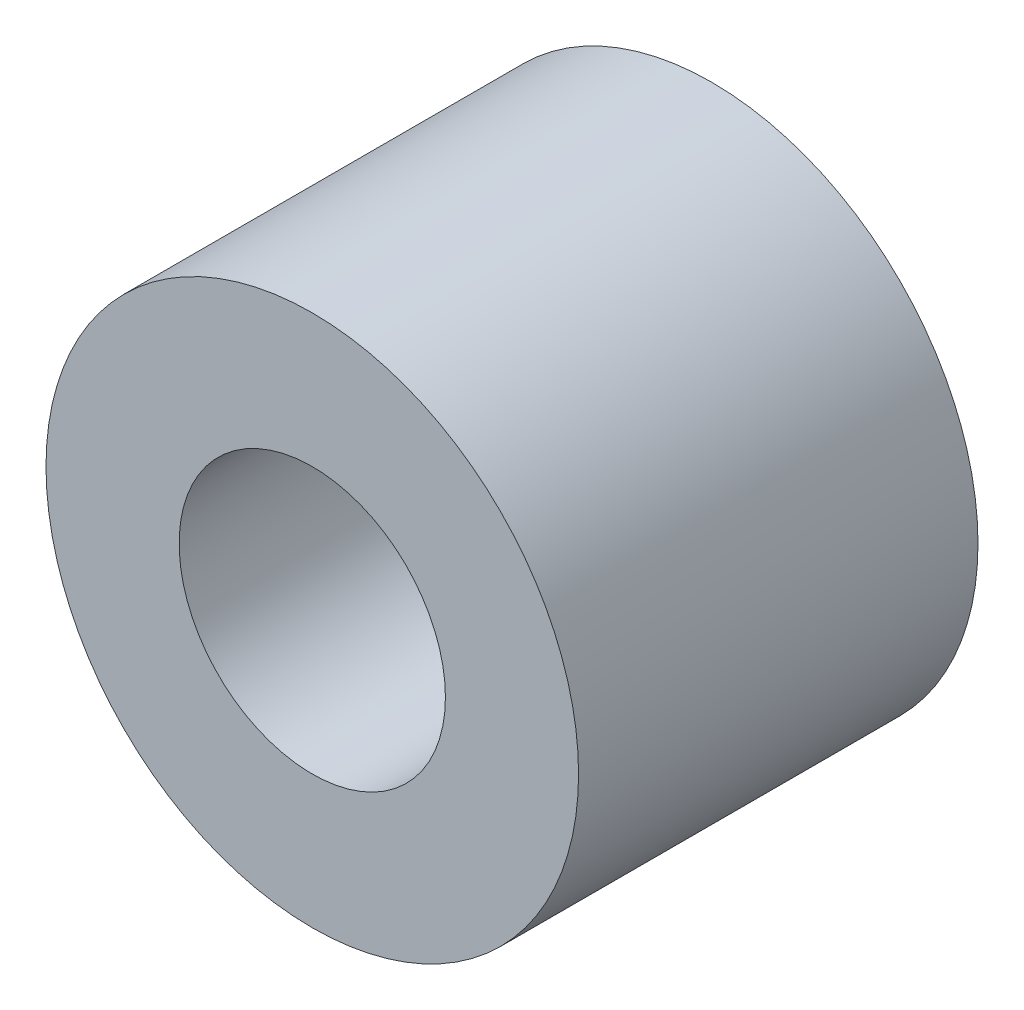
ISO-10303-21;
HEADER;
FILE_DESCRIPTION(('STEP AP214'),'2;1');
FILE_NAME('part.step','',(''),(''),'','','');
FILE_SCHEMA(('AUTOMOTIVE_DESIGN { 1 0 10303 214 1 1 1 1 }'));
ENDSEC;
DATA;
#1=APPLICATION_CONTEXT('core data for automotive mechanical design processes');
#2=APPLICATION_PROTOCOL_DEFINITION('international standard','automotive_design',2000,#1);
#3=PRODUCT_CONTEXT('',#1,'mechanical');
#4=PRODUCT('Part','Part','',(#3));
#5=PRODUCT_RELATED_PRODUCT_CATEGORY('part','',(#4));
#6=PRODUCT_DEFINITION_FORMATION('','',#4);
#7=PRODUCT_DEFINITION_CONTEXT('part definition',#1,'design');
#8=PRODUCT_DEFINITION('design','',#6,#7);
#9=PRODUCT_DEFINITION_SHAPE('','',#8);
#10=(LENGTH_UNIT() NAMED_UNIT(*) SI_UNIT(.MILLI.,.METRE.));
#11=(NAMED_UNIT(*) PLANE_ANGLE_UNIT() SI_UNIT($,.RADIAN.));
#12=(NAMED_UNIT(*) SI_UNIT($,.STERADIAN.) SOLID_ANGLE_UNIT());
#13=UNCERTAINTY_MEASURE_WITH_UNIT(LENGTH_MEASURE(1.E-05),#10,'distance_accuracy_value','');
#14=(GEOMETRIC_REPRESENTATION_CONTEXT(3) GLOBAL_UNCERTAINTY_ASSIGNED_CONTEXT((#13)) GLOBAL_UNIT_ASSIGNED_CONTEXT((#10,
#11,#12)) REPRESENTATION_CONTEXT('',''));
#15=CARTESIAN_POINT('',(0.,0.,0.));
#16=DIRECTION('',(0.,0.,1.));
#17=DIRECTION('',(1.,0.,0.));
#18=AXIS2_PLACEMENT_3D('',#15,#16,#17);
#19=CARTESIAN_POINT('',(0.,0.,6.));
#20=DIRECTION('',(0.,0.,1.));
#21=DIRECTION('',(1.,0.,0.));
#22=AXIS2_PLACEMENT_3D('',#19,#20,#21);
#23=PLANE('',#22);
#24=CARTESIAN_POINT('',(0.,0.,6.));
#25=DIRECTION('',(0.,0.,1.));
#26=DIRECTION('',(1.,0.,0.));
#27=AXIS2_PLACEMENT_3D('',#24,#25,#26);
#28=CIRCLE('',#27,4.);
#29=CARTESIAN_POINT('',(4.,0.,6.));
#30=VERTEX_POINT('',#29);
#31=EDGE_CURVE('E10',#30,#30,#28,.T.);
#32=ORIENTED_EDGE('',*,*,#31,.T.);
#33=EDGE_LOOP('',(#32));
#34=FACE_BOUND('',#33,.T.);
#35=CARTESIAN_POINT('',(0.,0.,6.));
#36=DIRECTION('',(0.,0.,1.));
#37=DIRECTION('',(1.,0.,0.));
#38=AXIS2_PLACEMENT_3D('',#35,#36,#37);
#39=CIRCLE('',#38,2.);
#40=CARTESIAN_POINT('',(2.,0.,6.));
#41=VERTEX_POINT('',#40);
#42=EDGE_CURVE('E49',#41,#41,#39,.T.);
#43=ORIENTED_EDGE('',*,*,#42,.F.);
#44=EDGE_LOOP('',(#43));
#45=FACE_BOUND('',#44,.T.);
#46=ADVANCED_FACE('F39',(#34,#45),#23,.T.);
#47=CARTESIAN_POINT('',(0.,0.,0.));
#48=DIRECTION('',(0.,0.,1.));
#49=DIRECTION('',(1.,0.,0.));
#50=AXIS2_PLACEMENT_3D('',#47,#48,#49);
#51=PLANE('',#50);
#52=CARTESIAN_POINT('',(0.,0.,0.));
#53=DIRECTION('',(0.,0.,1.));
#54=DIRECTION('',(1.,0.,0.));
#55=AXIS2_PLACEMENT_3D('',#52,#53,#54);
#56=CIRCLE('',#55,4.);
#57=CARTESIAN_POINT('',(4.,0.,0.));
#58=VERTEX_POINT('',#57);
#59=EDGE_CURVE('E43',#58,#58,#56,.T.);
#60=ORIENTED_EDGE('',*,*,#59,.F.);
#61=EDGE_LOOP('',(#60));
#62=FACE_BOUND('',#61,.T.);
#63=CARTESIAN_POINT('',(0.,0.,0.));
#64=DIRECTION('',(0.,0.,1.));
#65=DIRECTION('',(1.,0.,0.));
#66=AXIS2_PLACEMENT_3D('',#63,#64,#65);
#67=CIRCLE('',#66,2.);
#68=CARTESIAN_POINT('',(2.,0.,0.));
#69=VERTEX_POINT('',#68);
#70=EDGE_CURVE('E55',#69,#69,#67,.T.);
#71=ORIENTED_EDGE('',*,*,#70,.T.);
#72=EDGE_LOOP('',(#71));
#73=FACE_BOUND('',#72,.T.);
#74=ADVANCED_FACE('F64',(#62,#73),#51,.F.);
#75=CARTESIAN_POINT('',(0.,0.,6.));
#76=DIRECTION('',(0.,0.,-1.));
#77=DIRECTION('',(-1.,0.,0.));
#78=AXIS2_PLACEMENT_3D('',#75,#76,#77);
#79=CYLINDRICAL_SURFACE('',#78,4.);
#80=ORIENTED_EDGE('',*,*,#31,.F.);
#81=EDGE_LOOP('',(#80));
#82=FACE_BOUND('',#81,.T.);
#83=ORIENTED_EDGE('',*,*,#59,.T.);
#84=EDGE_LOOP('',(#83));
#85=FACE_BOUND('',#84,.T.);
#86=ADVANCED_FACE('F41',(#82,#85),#79,.T.);
#87=CARTESIAN_POINT('',(0.,0.,6.));
#88=DIRECTION('',(0.,0.,-1.));
#89=DIRECTION('',(-1.,0.,0.));
#90=AXIS2_PLACEMENT_3D('',#87,#88,#89);
#91=CYLINDRICAL_SURFACE('',#90,2.);
#92=ORIENTED_EDGE('',*,*,#42,.T.);
#93=EDGE_LOOP('',(#92));
#94=FACE_BOUND('',#93,.T.);
#95=ORIENTED_EDGE('',*,*,#70,.F.);
#96=EDGE_LOOP('',(#95));
#97=FACE_BOUND('',#96,.T.);
#98=ADVANCED_FACE('F59',(#94,#97),#91,.F.);
#99=CLOSED_SHELL('',(#46,#74,#86,#98));
#100=MANIFOLD_SOLID_BREP('B2',#99);
#101=ADVANCED_BREP_SHAPE_REPRESENTATION('',(#18,#100),#14);
#102=SHAPE_DEFINITION_REPRESENTATION(#9,#101);
ENDSEC;
END-ISO-10303-21;
